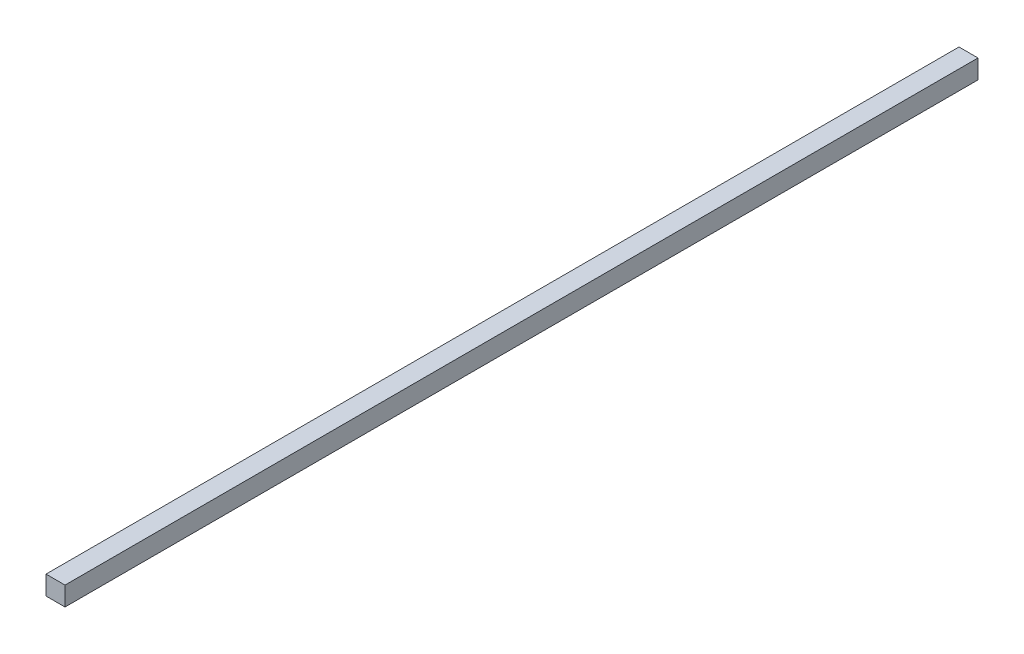
ISO-10303-21;
HEADER;
FILE_DESCRIPTION(('STEP AP214'),'2;1');
FILE_NAME('part.step','',(''),(''),'','','');
FILE_SCHEMA(('AUTOMOTIVE_DESIGN { 1 0 10303 214 1 1 1 1 }'));
ENDSEC;
DATA;
#1=APPLICATION_CONTEXT('core data for automotive mechanical design processes');
#2=APPLICATION_PROTOCOL_DEFINITION('international standard','automotive_design',2000,#1);
#3=PRODUCT_CONTEXT('',#1,'mechanical');
#4=PRODUCT('Part','Part','',(#3));
#5=PRODUCT_RELATED_PRODUCT_CATEGORY('part','',(#4));
#6=PRODUCT_DEFINITION_FORMATION('','',#4);
#7=PRODUCT_DEFINITION_CONTEXT('part definition',#1,'design');
#8=PRODUCT_DEFINITION('design','',#6,#7);
#9=PRODUCT_DEFINITION_SHAPE('','',#8);
#10=(LENGTH_UNIT() NAMED_UNIT(*) SI_UNIT(.MILLI.,.METRE.));
#11=(NAMED_UNIT(*) PLANE_ANGLE_UNIT() SI_UNIT($,.RADIAN.));
#12=(NAMED_UNIT(*) SI_UNIT($,.STERADIAN.) SOLID_ANGLE_UNIT());
#13=UNCERTAINTY_MEASURE_WITH_UNIT(LENGTH_MEASURE(1.E-05),#10,'distance_accuracy_value','');
#14=(GEOMETRIC_REPRESENTATION_CONTEXT(3) GLOBAL_UNCERTAINTY_ASSIGNED_CONTEXT((#13)) GLOBAL_UNIT_ASSIGNED_CONTEXT((#10,
#11,#12)) REPRESENTATION_CONTEXT('',''));
#15=CARTESIAN_POINT('',(0.,0.,0.));
#16=DIRECTION('',(0.,0.,1.));
#17=DIRECTION('',(1.,0.,0.));
#18=AXIS2_PLACEMENT_3D('',#15,#16,#17);
#19=CARTESIAN_POINT('',(-11.3932597673725,-2.18168804056069,304.8));
#20=DIRECTION('',(1.,0.,0.));
#21=DIRECTION('',(0.,1.,0.));
#22=AXIS2_PLACEMENT_3D('',#19,#20,#21);
#23=PLANE('',#22);
#24=DIRECTION('',(0.,-1.,0.));
#25=VECTOR('',#24,1.);
#26=CARTESIAN_POINT('',(-11.3932597673725,-2.18168804056069,0.));
#27=LINE('',#26,#25);
#28=CARTESIAN_POINT('',(-11.3932597673725,4.16831195943931,0.));
#29=VERTEX_POINT('',#28);
#30=CARTESIAN_POINT('',(-11.3932597673725,-2.18168804056069,0.));
#31=VERTEX_POINT('',#30);
#32=EDGE_CURVE('E109',#29,#31,#27,.T.);
#33=ORIENTED_EDGE('',*,*,#32,.T.);
#34=DIRECTION('',(0.,0.,-1.));
#35=VECTOR('',#34,1.);
#36=CARTESIAN_POINT('',(-11.3932597673725,-2.18168804056069,304.8));
#37=LINE('',#36,#35);
#38=CARTESIAN_POINT('',(-11.3932597673725,-2.18168804056069,304.8));
#39=VERTEX_POINT('',#38);
#40=EDGE_CURVE('E11',#39,#31,#37,.T.);
#41=ORIENTED_EDGE('',*,*,#40,.F.);
#42=DIRECTION('',(0.,-1.,0.));
#43=VECTOR('',#42,1.);
#44=CARTESIAN_POINT('',(-11.3932597673725,-2.18168804056069,304.8));
#45=LINE('',#44,#43);
#46=CARTESIAN_POINT('',(-11.3932597673725,4.16831195943931,304.8));
#47=VERTEX_POINT('',#46);
#48=EDGE_CURVE('E98',#47,#39,#45,.T.);
#49=ORIENTED_EDGE('',*,*,#48,.F.);
#50=DIRECTION('',(0.,0.,-1.));
#51=VECTOR('',#50,1.);
#52=CARTESIAN_POINT('',(-11.3932597673725,4.16831195943931,304.8));
#53=LINE('',#52,#51);
#54=EDGE_CURVE('E106',#47,#29,#53,.T.);
#55=ORIENTED_EDGE('',*,*,#54,.T.);
#56=EDGE_LOOP('',(#33,#41,#49,#55));
#57=FACE_BOUND('',#56,.T.);
#58=ADVANCED_FACE('F50',(#57),#23,.F.);
#59=CARTESIAN_POINT('',(-11.3932597673725,-2.18168804056069,304.8));
#60=DIRECTION('',(0.,1.,0.));
#61=DIRECTION('',(0.,0.,1.));
#62=AXIS2_PLACEMENT_3D('',#59,#60,#61);
#63=PLANE('',#62);
#64=DIRECTION('',(1.,0.,0.));
#65=VECTOR('',#64,1.);
#66=CARTESIAN_POINT('',(-11.3932597673725,-2.18168804056069,0.));
#67=LINE('',#66,#65);
#68=CARTESIAN_POINT('',(-5.04325976737249,-2.18168804056069,0.));
#69=VERTEX_POINT('',#68);
#70=EDGE_CURVE('E105',#31,#69,#67,.T.);
#71=ORIENTED_EDGE('',*,*,#70,.T.);
#72=DIRECTION('',(0.,0.,-1.));
#73=VECTOR('',#72,1.);
#74=CARTESIAN_POINT('',(-5.04325976737249,-2.18168804056069,304.8));
#75=LINE('',#74,#73);
#76=CARTESIAN_POINT('',(-5.04325976737249,-2.18168804056069,304.8));
#77=VERTEX_POINT('',#76);
#78=EDGE_CURVE('E54',#77,#69,#75,.T.);
#79=ORIENTED_EDGE('',*,*,#78,.F.);
#80=DIRECTION('',(1.,0.,0.));
#81=VECTOR('',#80,1.);
#82=CARTESIAN_POINT('',(-11.3932597673725,-2.18168804056069,304.8));
#83=LINE('',#82,#81);
#84=EDGE_CURVE('E91',#39,#77,#83,.T.);
#85=ORIENTED_EDGE('',*,*,#84,.F.);
#86=ORIENTED_EDGE('',*,*,#40,.T.);
#87=EDGE_LOOP('',(#71,#79,#85,#86));
#88=FACE_BOUND('',#87,.T.);
#89=ADVANCED_FACE('F101',(#88),#63,.F.);
#90=CARTESIAN_POINT('',(-5.04325976737249,-2.18168804056069,304.8));
#91=DIRECTION('',(-1.,0.,0.));
#92=DIRECTION('',(0.,0.,1.));
#93=AXIS2_PLACEMENT_3D('',#90,#91,#92);
#94=PLANE('',#93);
#95=DIRECTION('',(0.,1.,0.));
#96=VECTOR('',#95,1.);
#97=CARTESIAN_POINT('',(-5.04325976737249,-2.18168804056069,0.));
#98=LINE('',#97,#96);
#99=CARTESIAN_POINT('',(-5.04325976737249,4.16831195943931,0.));
#100=VERTEX_POINT('',#99);
#101=EDGE_CURVE('E78',#69,#100,#98,.T.);
#102=ORIENTED_EDGE('',*,*,#101,.T.);
#103=DIRECTION('',(0.,0.,-1.));
#104=VECTOR('',#103,1.);
#105=CARTESIAN_POINT('',(-5.04325976737249,4.16831195943931,304.8));
#106=LINE('',#105,#104);
#107=CARTESIAN_POINT('',(-5.04325976737249,4.16831195943931,304.8));
#108=VERTEX_POINT('',#107);
#109=EDGE_CURVE('E103',#108,#100,#106,.T.);
#110=ORIENTED_EDGE('',*,*,#109,.F.);
#111=DIRECTION('',(0.,1.,0.));
#112=VECTOR('',#111,1.);
#113=CARTESIAN_POINT('',(-5.04325976737249,-2.18168804056069,304.8));
#114=LINE('',#113,#112);
#115=EDGE_CURVE('E96',#77,#108,#114,.T.);
#116=ORIENTED_EDGE('',*,*,#115,.F.);
#117=ORIENTED_EDGE('',*,*,#78,.T.);
#118=EDGE_LOOP('',(#102,#110,#116,#117));
#119=FACE_BOUND('',#118,.T.);
#120=ADVANCED_FACE('F102',(#119),#94,.F.);
#121=CARTESIAN_POINT('',(-11.3932597673725,4.16831195943931,304.8));
#122=DIRECTION('',(0.,-1.,0.));
#123=DIRECTION('',(0.,0.,-1.));
#124=AXIS2_PLACEMENT_3D('',#121,#122,#123);
#125=PLANE('',#124);
#126=DIRECTION('',(-1.,0.,0.));
#127=VECTOR('',#126,1.);
#128=CARTESIAN_POINT('',(-11.3932597673725,4.16831195943931,0.));
#129=LINE('',#128,#127);
#130=EDGE_CURVE('E88',#100,#29,#129,.T.);
#131=ORIENTED_EDGE('',*,*,#130,.T.);
#132=ORIENTED_EDGE('',*,*,#54,.F.);
#133=DIRECTION('',(-1.,0.,0.));
#134=VECTOR('',#133,1.);
#135=CARTESIAN_POINT('',(-11.3932597673725,4.16831195943931,304.8));
#136=LINE('',#135,#134);
#137=EDGE_CURVE('E64',#108,#47,#136,.T.);
#138=ORIENTED_EDGE('',*,*,#137,.F.);
#139=ORIENTED_EDGE('',*,*,#109,.T.);
#140=EDGE_LOOP('',(#131,#132,#138,#139));
#141=FACE_BOUND('',#140,.T.);
#142=ADVANCED_FACE('F120',(#141),#125,.F.);
#143=CARTESIAN_POINT('',(0.,0.,304.8));
#144=DIRECTION('',(0.,0.,-1.));
#145=DIRECTION('',(-1.,0.,0.));
#146=AXIS2_PLACEMENT_3D('',#143,#144,#145);
#147=PLANE('',#146);
#148=ORIENTED_EDGE('',*,*,#48,.T.);
#149=ORIENTED_EDGE('',*,*,#84,.T.);
#150=ORIENTED_EDGE('',*,*,#115,.T.);
#151=ORIENTED_EDGE('',*,*,#137,.T.);
#152=EDGE_LOOP('',(#148,#149,#150,#151));
#153=FACE_BOUND('',#152,.T.);
#154=ADVANCED_FACE('F94',(#153),#147,.F.);
#155=CARTESIAN_POINT('',(0.,0.,0.));
#156=DIRECTION('',(0.,0.,-1.));
#157=DIRECTION('',(-1.,0.,0.));
#158=AXIS2_PLACEMENT_3D('',#155,#156,#157);
#159=PLANE('',#158);
#160=ORIENTED_EDGE('',*,*,#32,.F.);
#161=ORIENTED_EDGE('',*,*,#130,.F.);
#162=ORIENTED_EDGE('',*,*,#101,.F.);
#163=ORIENTED_EDGE('',*,*,#70,.F.);
#164=EDGE_LOOP('',(#160,#161,#162,#163));
#165=FACE_BOUND('',#164,.T.);
#166=ADVANCED_FACE('F118',(#165),#159,.T.);
#167=CLOSED_SHELL('',(#58,#89,#120,#142,#154,#166));
#168=MANIFOLD_SOLID_BREP('B2',#167);
#169=ADVANCED_BREP_SHAPE_REPRESENTATION('',(#18,#168),#14);
#170=SHAPE_DEFINITION_REPRESENTATION(#9,#169);
ENDSEC;
END-ISO-10303-21;
